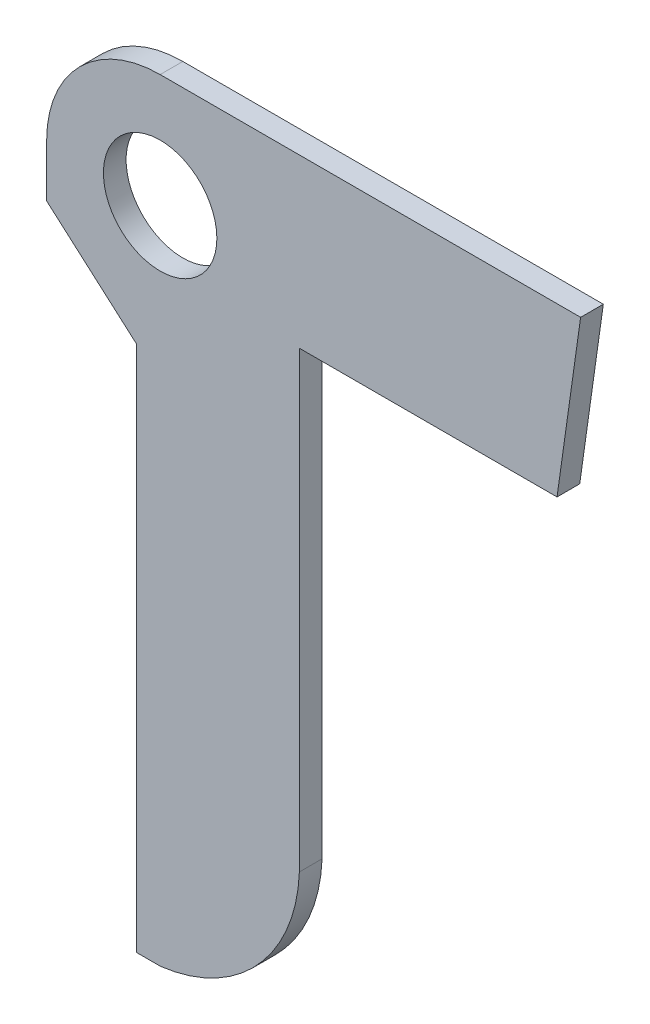
ISO-10303-21;
HEADER;
FILE_DESCRIPTION(('STEP AP214'),'2;1');
FILE_NAME('part.step','',(''),(''),'','','');
FILE_SCHEMA(('AUTOMOTIVE_DESIGN { 1 0 10303 214 1 1 1 1 }'));
ENDSEC;
DATA;
#1=APPLICATION_CONTEXT('core data for automotive mechanical design processes');
#2=APPLICATION_PROTOCOL_DEFINITION('international standard','automotive_design',2000,#1);
#3=PRODUCT_CONTEXT('',#1,'mechanical');
#4=PRODUCT('Part','Part','',(#3));
#5=PRODUCT_RELATED_PRODUCT_CATEGORY('part','',(#4));
#6=PRODUCT_DEFINITION_FORMATION('','',#4);
#7=PRODUCT_DEFINITION_CONTEXT('part definition',#1,'design');
#8=PRODUCT_DEFINITION('design','',#6,#7);
#9=PRODUCT_DEFINITION_SHAPE('','',#8);
#10=(LENGTH_UNIT() NAMED_UNIT(*) SI_UNIT(.MILLI.,.METRE.));
#11=(NAMED_UNIT(*) PLANE_ANGLE_UNIT() SI_UNIT($,.RADIAN.));
#12=(NAMED_UNIT(*) SI_UNIT($,.STERADIAN.) SOLID_ANGLE_UNIT());
#13=UNCERTAINTY_MEASURE_WITH_UNIT(LENGTH_MEASURE(1.E-05),#10,'distance_accuracy_value','');
#14=(GEOMETRIC_REPRESENTATION_CONTEXT(3) GLOBAL_UNCERTAINTY_ASSIGNED_CONTEXT((#13)) GLOBAL_UNIT_ASSIGNED_CONTEXT((#10,
#11,#12)) REPRESENTATION_CONTEXT('',''));
#15=CARTESIAN_POINT('',(0.,0.,0.));
#16=DIRECTION('',(0.,0.,1.));
#17=DIRECTION('',(1.,0.,0.));
#18=AXIS2_PLACEMENT_3D('',#15,#16,#17);
#19=CARTESIAN_POINT('',(0.,-29.0249208511568,1.));
#20=DIRECTION('',(0.,1.,0.));
#21=DIRECTION('',(0.,0.,1.));
#22=AXIS2_PLACEMENT_3D('',#19,#20,#21);
#23=PLANE('',#22);
#24=DIRECTION('',(1.,0.,0.));
#25=VECTOR('',#24,1.);
#26=CARTESIAN_POINT('',(0.,-29.0249208511568,0.));
#27=LINE('',#26,#25);
#28=CARTESIAN_POINT('',(-1.04361936825604,-29.0249208511568,0.));
#29=VERTEX_POINT('',#28);
#30=CARTESIAN_POINT('',(0.023324735362753,-29.0249208511568,0.));
#31=VERTEX_POINT('',#30);
#32=EDGE_CURVE('E147',#29,#31,#27,.T.);
#33=ORIENTED_EDGE('',*,*,#32,.T.);
#34=DIRECTION('',(0.,0.,-1.));
#35=VECTOR('',#34,1.);
#36=CARTESIAN_POINT('',(0.023324735362753,-29.0249208511568,1.));
#37=LINE('',#36,#35);
#38=CARTESIAN_POINT('',(0.023324735362753,-29.0249208511568,1.));
#39=VERTEX_POINT('',#38);
#40=EDGE_CURVE('E11',#39,#31,#37,.T.);
#41=ORIENTED_EDGE('',*,*,#40,.F.);
#42=DIRECTION('',(1.,0.,0.));
#43=VECTOR('',#42,1.);
#44=CARTESIAN_POINT('',(0.,-29.0249208511568,1.));
#45=LINE('',#44,#43);
#46=CARTESIAN_POINT('',(-1.04361936825604,-29.0249208511568,1.));
#47=VERTEX_POINT('',#46);
#48=EDGE_CURVE('E168',#47,#39,#45,.T.);
#49=ORIENTED_EDGE('',*,*,#48,.F.);
#50=DIRECTION('',(0.,0.,-1.));
#51=VECTOR('',#50,1.);
#52=CARTESIAN_POINT('',(-1.04361936825604,-29.0249208511568,1.));
#53=LINE('',#52,#51);
#54=EDGE_CURVE('E146',#47,#29,#53,.T.);
#55=ORIENTED_EDGE('',*,*,#54,.T.);
#56=EDGE_LOOP('',(#33,#41,#49,#55));
#57=FACE_BOUND('',#56,.T.);
#58=ADVANCED_FACE('F35',(#57),#23,.F.);
#59=CARTESIAN_POINT('',(-0.83684568557322,-22.1016793202414,1.));
#60=DIRECTION('',(0.,0.,-1.));
#61=DIRECTION('',(-1.,0.,0.));
#62=AXIS2_PLACEMENT_3D('',#59,#60,#61);
#63=CYLINDRICAL_SURFACE('',#62,6.976472349866);
#64=CARTESIAN_POINT('',(-0.83684568557322,-22.1016793202414,0.));
#65=DIRECTION('',(0.,0.,1.));
#66=DIRECTION('',(1.,0.,0.));
#67=AXIS2_PLACEMENT_3D('',#64,#65,#66);
#68=CIRCLE('',#67,6.976472349866);
#69=CARTESIAN_POINT('',(6.13472232438994,-22.3632245952956,0.));
#70=VERTEX_POINT('',#69);
#71=EDGE_CURVE('E150',#31,#70,#68,.T.);
#72=ORIENTED_EDGE('',*,*,#71,.T.);
#73=DIRECTION('',(0.,0.,-1.));
#74=VECTOR('',#73,1.);
#75=CARTESIAN_POINT('',(6.13472232438994,-22.3632245952956,1.));
#76=LINE('',#75,#74);
#77=CARTESIAN_POINT('',(6.13472232438994,-22.3632245952956,1.));
#78=VERTEX_POINT('',#77);
#79=EDGE_CURVE('E43',#78,#70,#76,.T.);
#80=ORIENTED_EDGE('',*,*,#79,.F.);
#81=CARTESIAN_POINT('',(-0.83684568557322,-22.1016793202414,1.));
#82=DIRECTION('',(0.,0.,1.));
#83=DIRECTION('',(1.,0.,0.));
#84=AXIS2_PLACEMENT_3D('',#81,#82,#83);
#85=CIRCLE('',#84,6.976472349866);
#86=EDGE_CURVE('E100',#39,#78,#85,.T.);
#87=ORIENTED_EDGE('',*,*,#86,.F.);
#88=ORIENTED_EDGE('',*,*,#40,.T.);
#89=EDGE_LOOP('',(#72,#80,#87,#88));
#90=FACE_BOUND('',#89,.T.);
#91=ADVANCED_FACE('F218',(#90),#63,.T.);
#92=CARTESIAN_POINT('',(6.13472232438994,0.,1.));
#93=DIRECTION('',(-1.,0.,0.));
#94=DIRECTION('',(0.,0.,1.));
#95=AXIS2_PLACEMENT_3D('',#92,#93,#94);
#96=PLANE('',#95);
#97=DIRECTION('',(0.,1.,0.));
#98=VECTOR('',#97,1.);
#99=CARTESIAN_POINT('',(6.13472232438994,0.,0.));
#100=LINE('',#99,#98);
#101=CARTESIAN_POINT('',(6.13472232438994,-2.37613806837089,0.));
#102=VERTEX_POINT('',#101);
#103=EDGE_CURVE('E152',#70,#102,#100,.T.);
#104=ORIENTED_EDGE('',*,*,#103,.T.);
#105=DIRECTION('',(0.,0.,-1.));
#106=VECTOR('',#105,1.);
#107=CARTESIAN_POINT('',(6.13472232438994,-2.37613806837089,1.));
#108=LINE('',#107,#106);
#109=CARTESIAN_POINT('',(6.13472232438994,-2.37613806837089,1.));
#110=VERTEX_POINT('',#109);
#111=EDGE_CURVE('E181',#110,#102,#108,.T.);
#112=ORIENTED_EDGE('',*,*,#111,.F.);
#113=DIRECTION('',(0.,1.,0.));
#114=VECTOR('',#113,1.);
#115=CARTESIAN_POINT('',(6.13472232438994,0.,1.));
#116=LINE('',#115,#114);
#117=EDGE_CURVE('E189',#78,#110,#116,.T.);
#118=ORIENTED_EDGE('',*,*,#117,.F.);
#119=ORIENTED_EDGE('',*,*,#79,.T.);
#120=EDGE_LOOP('',(#104,#112,#118,#119));
#121=FACE_BOUND('',#120,.T.);
#122=ADVANCED_FACE('F187',(#121),#96,.F.);
#123=CARTESIAN_POINT('',(0.,-2.37613806837089,1.));
#124=DIRECTION('',(0.,1.,0.));
#125=DIRECTION('',(0.,0.,1.));
#126=AXIS2_PLACEMENT_3D('',#123,#124,#125);
#127=PLANE('',#126);
#128=DIRECTION('',(1.,0.,0.));
#129=VECTOR('',#128,1.);
#130=CARTESIAN_POINT('',(0.,-2.37613806837089,0.));
#131=LINE('',#130,#129);
#132=CARTESIAN_POINT('',(17.4895244265798,-2.37613806837089,0.));
#133=VERTEX_POINT('',#132);
#134=EDGE_CURVE('E154',#102,#133,#131,.T.);
#135=ORIENTED_EDGE('',*,*,#134,.T.);
#136=DIRECTION('',(0.,0.,-1.));
#137=VECTOR('',#136,1.);
#138=CARTESIAN_POINT('',(17.4895244265798,-2.37613806837089,1.));
#139=LINE('',#138,#137);
#140=CARTESIAN_POINT('',(17.4895244265798,-2.37613806837089,1.));
#141=VERTEX_POINT('',#140);
#142=EDGE_CURVE('E178',#141,#133,#139,.T.);
#143=ORIENTED_EDGE('',*,*,#142,.F.);
#144=DIRECTION('',(1.,0.,0.));
#145=VECTOR('',#144,1.);
#146=CARTESIAN_POINT('',(0.,-2.37613806837089,1.));
#147=LINE('',#146,#145);
#148=EDGE_CURVE('E208',#110,#141,#147,.T.);
#149=ORIENTED_EDGE('',*,*,#148,.F.);
#150=ORIENTED_EDGE('',*,*,#111,.T.);
#151=EDGE_LOOP('',(#135,#143,#149,#150));
#152=FACE_BOUND('',#151,.T.);
#153=ADVANCED_FACE('F199',(#152),#127,.F.);
#154=CARTESIAN_POINT('',(17.4772777934055,-2.46303799067487,1.));
#155=DIRECTION('',(-0.990215159418648,0.139549052513805,0.));
#156=DIRECTION('',(-0.139549052513805,-0.990215159418648,0.));
#157=AXIS2_PLACEMENT_3D('',#154,#155,#156);
#158=PLANE('',#157);
#159=DIRECTION('',(0.139549052513805,0.990215159418649,0.));
#160=VECTOR('',#159,1.);
#161=CARTESIAN_POINT('',(17.4772777934055,-2.46303799067487,0.));
#162=LINE('',#161,#160);
#163=CARTESIAN_POINT('',(18.529028890697,5.,0.));
#164=VERTEX_POINT('',#163);
#165=EDGE_CURVE('E156',#133,#164,#162,.T.);
#166=ORIENTED_EDGE('',*,*,#165,.T.);
#167=DIRECTION('',(0.,0.,-1.));
#168=VECTOR('',#167,1.);
#169=CARTESIAN_POINT('',(18.529028890697,5.,1.));
#170=LINE('',#169,#168);
#171=CARTESIAN_POINT('',(18.529028890697,5.,1.));
#172=VERTEX_POINT('',#171);
#173=EDGE_CURVE('E175',#172,#164,#170,.T.);
#174=ORIENTED_EDGE('',*,*,#173,.F.);
#175=DIRECTION('',(0.139549052513805,0.990215159418649,0.));
#176=VECTOR('',#175,1.);
#177=CARTESIAN_POINT('',(17.4772777934055,-2.46303799067487,1.));
#178=LINE('',#177,#176);
#179=EDGE_CURVE('E205',#141,#172,#178,.T.);
#180=ORIENTED_EDGE('',*,*,#179,.F.);
#181=ORIENTED_EDGE('',*,*,#142,.T.);
#182=EDGE_LOOP('',(#166,#174,#180,#181));
#183=FACE_BOUND('',#182,.T.);
#184=ADVANCED_FACE('F203',(#183),#158,.F.);
#185=CARTESIAN_POINT('',(0.,5.,1.));
#186=DIRECTION('',(0.,-1.,0.));
#187=DIRECTION('',(1.,0.,0.));
#188=AXIS2_PLACEMENT_3D('',#185,#186,#187);
#189=PLANE('',#188);
#190=DIRECTION('',(-1.,0.,0.));
#191=VECTOR('',#190,1.);
#192=CARTESIAN_POINT('',(0.,5.,0.));
#193=LINE('',#192,#191);
#194=CARTESIAN_POINT('',(0.,5.,0.));
#195=VERTEX_POINT('',#194);
#196=EDGE_CURVE('E158',#164,#195,#193,.T.);
#197=ORIENTED_EDGE('',*,*,#196,.T.);
#198=DIRECTION('',(0.,0.,-1.));
#199=VECTOR('',#198,1.);
#200=CARTESIAN_POINT('',(0.,5.,1.));
#201=LINE('',#200,#199);
#202=CARTESIAN_POINT('',(0.,5.,1.));
#203=VERTEX_POINT('',#202);
#204=EDGE_CURVE('E172',#203,#195,#201,.T.);
#205=ORIENTED_EDGE('',*,*,#204,.F.);
#206=DIRECTION('',(-1.,0.,0.));
#207=VECTOR('',#206,1.);
#208=CARTESIAN_POINT('',(0.,5.,1.));
#209=LINE('',#208,#207);
#210=EDGE_CURVE('E207',#172,#203,#209,.T.);
#211=ORIENTED_EDGE('',*,*,#210,.F.);
#212=ORIENTED_EDGE('',*,*,#173,.T.);
#213=EDGE_LOOP('',(#197,#205,#211,#212));
#214=FACE_BOUND('',#213,.T.);
#215=ADVANCED_FACE('F230',(#214),#189,.F.);
#216=CARTESIAN_POINT('',(0.,0.,1.));
#217=DIRECTION('',(0.,0.,-1.));
#218=DIRECTION('',(-1.,0.,0.));
#219=AXIS2_PLACEMENT_3D('',#216,#217,#218);
#220=CYLINDRICAL_SURFACE('',#219,5.);
#221=CARTESIAN_POINT('',(0.,0.,0.));
#222=DIRECTION('',(0.,0.,1.));
#223=DIRECTION('',(1.,0.,0.));
#224=AXIS2_PLACEMENT_3D('',#221,#222,#223);
#225=CIRCLE('',#224,5.);
#226=CARTESIAN_POINT('',(-5.,0.,0.));
#227=VERTEX_POINT('',#226);
#228=EDGE_CURVE('E160',#195,#227,#225,.T.);
#229=ORIENTED_EDGE('',*,*,#228,.T.);
#230=DIRECTION('',(0.,0.,-1.));
#231=VECTOR('',#230,1.);
#232=CARTESIAN_POINT('',(-5.,0.,1.));
#233=LINE('',#232,#231);
#234=CARTESIAN_POINT('',(-5.,0.,1.));
#235=VERTEX_POINT('',#234);
#236=EDGE_CURVE('E135',#235,#227,#233,.T.);
#237=ORIENTED_EDGE('',*,*,#236,.F.);
#238=CARTESIAN_POINT('',(0.,0.,1.));
#239=DIRECTION('',(0.,0.,1.));
#240=DIRECTION('',(1.,0.,0.));
#241=AXIS2_PLACEMENT_3D('',#238,#239,#240);
#242=CIRCLE('',#241,5.);
#243=EDGE_CURVE('E126',#203,#235,#242,.T.);
#244=ORIENTED_EDGE('',*,*,#243,.F.);
#245=ORIENTED_EDGE('',*,*,#204,.T.);
#246=EDGE_LOOP('',(#229,#237,#244,#245));
#247=FACE_BOUND('',#246,.T.);
#248=ADVANCED_FACE('F233',(#247),#220,.T.);
#249=CARTESIAN_POINT('',(-5.,0.,1.));
#250=DIRECTION('',(1.,0.,0.));
#251=DIRECTION('',(0.,0.,-1.));
#252=AXIS2_PLACEMENT_3D('',#249,#250,#251);
#253=PLANE('',#252);
#254=DIRECTION('',(0.,-1.,0.));
#255=VECTOR('',#254,1.);
#256=CARTESIAN_POINT('',(-5.,0.,0.));
#257=LINE('',#256,#255);
#258=CARTESIAN_POINT('',(-5.,-2.32647439688253,0.));
#259=VERTEX_POINT('',#258);
#260=EDGE_CURVE('E134',#227,#259,#257,.T.);
#261=ORIENTED_EDGE('',*,*,#260,.T.);
#262=DIRECTION('',(0.,0.,-1.));
#263=VECTOR('',#262,1.);
#264=CARTESIAN_POINT('',(-5.,-2.32647439688253,1.));
#265=LINE('',#264,#263);
#266=CARTESIAN_POINT('',(-5.,-2.32647439688253,1.));
#267=VERTEX_POINT('',#266);
#268=EDGE_CURVE('E131',#267,#259,#265,.T.);
#269=ORIENTED_EDGE('',*,*,#268,.F.);
#270=DIRECTION('',(0.,-1.,0.));
#271=VECTOR('',#270,1.);
#272=CARTESIAN_POINT('',(-5.,0.,1.));
#273=LINE('',#272,#271);
#274=EDGE_CURVE('E119',#235,#267,#273,.T.);
#275=ORIENTED_EDGE('',*,*,#274,.F.);
#276=ORIENTED_EDGE('',*,*,#236,.T.);
#277=EDGE_LOOP('',(#261,#269,#275,#276));
#278=FACE_BOUND('',#277,.T.);
#279=ADVANCED_FACE('F132',(#278),#253,.F.);
#280=CARTESIAN_POINT('',(-3.32960365921922,-3.79285286398016,1.));
#281=DIRECTION('',(0.659722162079872,0.751509593325767,0.));
#282=DIRECTION('',(-0.751509593325767,0.659722162079872,0.));
#283=AXIS2_PLACEMENT_3D('',#280,#281,#282);
#284=PLANE('',#283);
#285=DIRECTION('',(0.751509593325767,-0.659722162079872,0.));
#286=VECTOR('',#285,1.);
#287=CARTESIAN_POINT('',(-3.32960365921922,-3.79285286398016,0.));
#288=LINE('',#287,#286);
#289=CARTESIAN_POINT('',(-1.04361936825604,-5.79963296673411,0.));
#290=VERTEX_POINT('',#289);
#291=EDGE_CURVE('E86',#259,#290,#288,.T.);
#292=ORIENTED_EDGE('',*,*,#291,.T.);
#293=DIRECTION('',(0.,0.,-1.));
#294=VECTOR('',#293,1.);
#295=CARTESIAN_POINT('',(-1.04361936825604,-5.79963296673411,1.));
#296=LINE('',#295,#294);
#297=CARTESIAN_POINT('',(-1.04361936825604,-5.79963296673411,1.));
#298=VERTEX_POINT('',#297);
#299=EDGE_CURVE('E136',#298,#290,#296,.T.);
#300=ORIENTED_EDGE('',*,*,#299,.F.);
#301=DIRECTION('',(0.751509593325767,-0.659722162079872,0.));
#302=VECTOR('',#301,1.);
#303=CARTESIAN_POINT('',(-3.32960365921922,-3.79285286398016,1.));
#304=LINE('',#303,#302);
#305=EDGE_CURVE('E124',#267,#298,#304,.T.);
#306=ORIENTED_EDGE('',*,*,#305,.F.);
#307=ORIENTED_EDGE('',*,*,#268,.T.);
#308=EDGE_LOOP('',(#292,#300,#306,#307));
#309=FACE_BOUND('',#308,.T.);
#310=ADVANCED_FACE('F138',(#309),#284,.F.);
#311=CARTESIAN_POINT('',(-1.04361936825604,0.,1.));
#312=DIRECTION('',(1.,0.,0.));
#313=DIRECTION('',(0.,0.,-1.));
#314=AXIS2_PLACEMENT_3D('',#311,#312,#313);
#315=PLANE('',#314);
#316=DIRECTION('',(0.,-1.,0.));
#317=VECTOR('',#316,1.);
#318=CARTESIAN_POINT('',(-1.04361936825604,0.,0.));
#319=LINE('',#318,#317);
#320=EDGE_CURVE('E92',#290,#29,#319,.T.);
#321=ORIENTED_EDGE('',*,*,#320,.T.);
#322=ORIENTED_EDGE('',*,*,#54,.F.);
#323=DIRECTION('',(0.,-1.,0.));
#324=VECTOR('',#323,1.);
#325=CARTESIAN_POINT('',(-1.04361936825604,0.,1.));
#326=LINE('',#325,#324);
#327=EDGE_CURVE('E51',#298,#47,#326,.T.);
#328=ORIENTED_EDGE('',*,*,#327,.F.);
#329=ORIENTED_EDGE('',*,*,#299,.T.);
#330=EDGE_LOOP('',(#321,#322,#328,#329));
#331=FACE_BOUND('',#330,.T.);
#332=ADVANCED_FACE('F242',(#331),#315,.F.);
#333=CARTESIAN_POINT('',(0.,0.,1.));
#334=DIRECTION('',(0.,0.,-1.));
#335=DIRECTION('',(-1.,0.,0.));
#336=AXIS2_PLACEMENT_3D('',#333,#334,#335);
#337=CYLINDRICAL_SURFACE('',#336,2.5);
#338=CARTESIAN_POINT('',(0.,0.,1.));
#339=DIRECTION('',(0.,0.,1.));
#340=DIRECTION('',(1.,0.,0.));
#341=AXIS2_PLACEMENT_3D('',#338,#339,#340);
#342=CIRCLE('',#341,2.5);
#343=CARTESIAN_POINT('',(2.5,0.,1.));
#344=VERTEX_POINT('',#343);
#345=EDGE_CURVE('E140',#344,#344,#342,.T.);
#346=ORIENTED_EDGE('',*,*,#345,.T.);
#347=EDGE_LOOP('',(#346));
#348=FACE_BOUND('',#347,.T.);
#349=CARTESIAN_POINT('',(0.,0.,0.));
#350=DIRECTION('',(0.,0.,1.));
#351=DIRECTION('',(1.,0.,0.));
#352=AXIS2_PLACEMENT_3D('',#349,#350,#351);
#353=CIRCLE('',#352,2.5);
#354=CARTESIAN_POINT('',(2.5,0.,0.));
#355=VERTEX_POINT('',#354);
#356=EDGE_CURVE('E165',#355,#355,#353,.T.);
#357=ORIENTED_EDGE('',*,*,#356,.F.);
#358=EDGE_LOOP('',(#357));
#359=FACE_BOUND('',#358,.T.);
#360=ADVANCED_FACE('F245',(#348,#359),#337,.F.);
#361=CARTESIAN_POINT('',(0.,0.,1.));
#362=DIRECTION('',(0.,0.,1.));
#363=DIRECTION('',(1.,0.,0.));
#364=AXIS2_PLACEMENT_3D('',#361,#362,#363);
#365=PLANE('',#364);
#366=ORIENTED_EDGE('',*,*,#48,.T.);
#367=ORIENTED_EDGE('',*,*,#86,.T.);
#368=ORIENTED_EDGE('',*,*,#117,.T.);
#369=ORIENTED_EDGE('',*,*,#148,.T.);
#370=ORIENTED_EDGE('',*,*,#179,.T.);
#371=ORIENTED_EDGE('',*,*,#210,.T.);
#372=ORIENTED_EDGE('',*,*,#243,.T.);
#373=ORIENTED_EDGE('',*,*,#274,.T.);
#374=ORIENTED_EDGE('',*,*,#305,.T.);
#375=ORIENTED_EDGE('',*,*,#327,.T.);
#376=EDGE_LOOP('',(#366,#367,#368,#369,#370,#371,#372,#373,#374,#375));
#377=FACE_BOUND('',#376,.T.);
#378=ORIENTED_EDGE('',*,*,#345,.F.);
#379=EDGE_LOOP('',(#378));
#380=FACE_BOUND('',#379,.T.);
#381=ADVANCED_FACE('F121',(#377,#380),#365,.T.);
#382=CARTESIAN_POINT('',(0.,0.,0.));
#383=DIRECTION('',(0.,0.,1.));
#384=DIRECTION('',(1.,0.,0.));
#385=AXIS2_PLACEMENT_3D('',#382,#383,#384);
#386=PLANE('',#385);
#387=ORIENTED_EDGE('',*,*,#32,.F.);
#388=ORIENTED_EDGE('',*,*,#320,.F.);
#389=ORIENTED_EDGE('',*,*,#291,.F.);
#390=ORIENTED_EDGE('',*,*,#260,.F.);
#391=ORIENTED_EDGE('',*,*,#228,.F.);
#392=ORIENTED_EDGE('',*,*,#196,.F.);
#393=ORIENTED_EDGE('',*,*,#165,.F.);
#394=ORIENTED_EDGE('',*,*,#134,.F.);
#395=ORIENTED_EDGE('',*,*,#103,.F.);
#396=ORIENTED_EDGE('',*,*,#71,.F.);
#397=EDGE_LOOP('',(#387,#388,#389,#390,#391,#392,#393,#394,#395,#396));
#398=FACE_BOUND('',#397,.T.);
#399=ORIENTED_EDGE('',*,*,#356,.T.);
#400=EDGE_LOOP('',(#399));
#401=FACE_BOUND('',#400,.T.);
#402=ADVANCED_FACE('F193',(#398,#401),#386,.F.);
#403=CLOSED_SHELL('',(#58,#91,#122,#153,#184,#215,#248,#279,#310,#332,#360,#381,#402));
#404=MANIFOLD_SOLID_BREP('B2',#403);
#405=ADVANCED_BREP_SHAPE_REPRESENTATION('',(#18,#404),#14);
#406=SHAPE_DEFINITION_REPRESENTATION(#9,#405);
ENDSEC;
END-ISO-10303-21;
